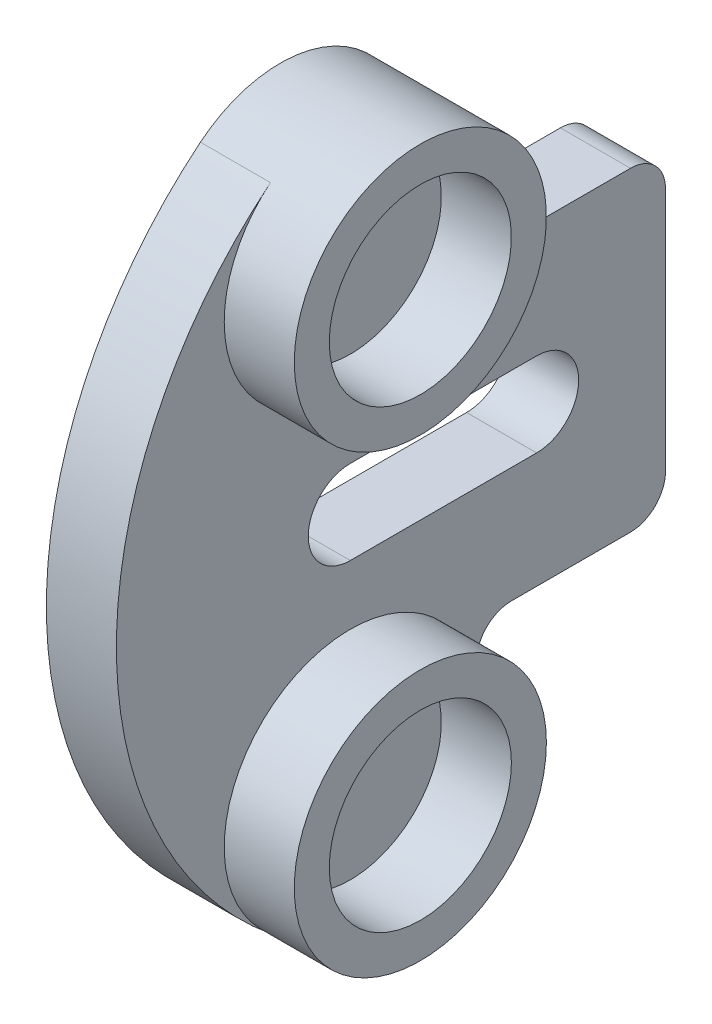
ISO-10303-21;
HEADER;
FILE_DESCRIPTION(('STEP AP214'),'2;1');
FILE_NAME('part.step','',(''),(''),'','','');
FILE_SCHEMA(('AUTOMOTIVE_DESIGN { 1 0 10303 214 1 1 1 1 }'));
ENDSEC;
DATA;
#1=APPLICATION_CONTEXT('core data for automotive mechanical design processes');
#2=APPLICATION_PROTOCOL_DEFINITION('international standard','automotive_design',2000,#1);
#3=PRODUCT_CONTEXT('',#1,'mechanical');
#4=PRODUCT('Part','Part','',(#3));
#5=PRODUCT_RELATED_PRODUCT_CATEGORY('part','',(#4));
#6=PRODUCT_DEFINITION_FORMATION('','',#4);
#7=PRODUCT_DEFINITION_CONTEXT('part definition',#1,'design');
#8=PRODUCT_DEFINITION('design','',#6,#7);
#9=PRODUCT_DEFINITION_SHAPE('','',#8);
#10=(LENGTH_UNIT() NAMED_UNIT(*) SI_UNIT(.MILLI.,.METRE.));
#11=(NAMED_UNIT(*) PLANE_ANGLE_UNIT() SI_UNIT($,.RADIAN.));
#12=(NAMED_UNIT(*) SI_UNIT($,.STERADIAN.) SOLID_ANGLE_UNIT());
#13=UNCERTAINTY_MEASURE_WITH_UNIT(LENGTH_MEASURE(1.E-05),#10,'distance_accuracy_value','');
#14=(GEOMETRIC_REPRESENTATION_CONTEXT(3) GLOBAL_UNCERTAINTY_ASSIGNED_CONTEXT((#13)) GLOBAL_UNIT_ASSIGNED_CONTEXT((#10,
#11,#12)) REPRESENTATION_CONTEXT('',''));
#15=CARTESIAN_POINT('',(0.,0.,0.));
#16=DIRECTION('',(0.,0.,1.));
#17=DIRECTION('',(1.,0.,0.));
#18=AXIS2_PLACEMENT_3D('',#15,#16,#17);
#19=CARTESIAN_POINT('',(10.,-32.5,26.6035711888461));
#20=DIRECTION('',(-1.,0.,0.));
#21=DIRECTION('',(0.,0.,1.));
#22=AXIS2_PLACEMENT_3D('',#19,#20,#21);
#23=PLANE('',#22);
#24=CARTESIAN_POINT('',(10.,-32.5,26.6035711888461));
#25=DIRECTION('',(-1.,0.,0.));
#26=DIRECTION('',(0.,0.,1.));
#27=AXIS2_PLACEMENT_3D('',#24,#25,#26);
#28=CIRCLE('',#27,18.);
#29=CARTESIAN_POINT('',(10.,-32.5,8.60357118884607));
#30=VERTEX_POINT('',#29);
#31=CARTESIAN_POINT('',(10.,-46.4285714285714,38.0051016983515));
#32=VERTEX_POINT('',#31);
#33=EDGE_CURVE('E181',#30,#32,#28,.F.);
#34=ORIENTED_EDGE('',*,*,#33,.F.);
#35=DIRECTION('',(0.,1.,0.));
#36=VECTOR('',#35,1.);
#37=CARTESIAN_POINT('',(10.,-27.5,8.60357118884607));
#38=LINE('',#37,#36);
#39=CARTESIAN_POINT('',(10.,-27.5,8.60357118884608));
#40=VERTEX_POINT('',#39);
#41=EDGE_CURVE('E225',#30,#40,#38,.T.);
#42=ORIENTED_EDGE('',*,*,#41,.T.);
#43=CARTESIAN_POINT('',(10.,-27.5,3.60357118884607));
#44=DIRECTION('',(-1.,0.,0.));
#45=DIRECTION('',(0.,0.,-1.));
#46=AXIS2_PLACEMENT_3D('',#43,#44,#45);
#47=CIRCLE('',#46,5.);
#48=CARTESIAN_POINT('',(10.,-22.5,3.60357118884607));
#49=VERTEX_POINT('',#48);
#50=EDGE_CURVE('E227',#40,#49,#47,.T.);
#51=ORIENTED_EDGE('',*,*,#50,.T.);
#52=DIRECTION('',(0.,0.,-1.));
#53=VECTOR('',#52,1.);
#54=CARTESIAN_POINT('',(10.,-22.5,-13.3964288111539));
#55=LINE('',#54,#53);
#56=CARTESIAN_POINT('',(10.,-22.5,-13.3964288111539));
#57=VERTEX_POINT('',#56);
#58=EDGE_CURVE('E230',#49,#57,#55,.T.);
#59=ORIENTED_EDGE('',*,*,#58,.T.);
#60=CARTESIAN_POINT('',(10.,-17.5,-13.3964288111539));
#61=DIRECTION('',(1.,0.,0.));
#62=DIRECTION('',(0.,0.,1.));
#63=AXIS2_PLACEMENT_3D('',#60,#61,#62);
#64=CIRCLE('',#63,5.);
#65=CARTESIAN_POINT('',(10.,-17.5,-18.3964288111539));
#66=VERTEX_POINT('',#65);
#67=EDGE_CURVE('E232',#57,#66,#64,.T.);
#68=ORIENTED_EDGE('',*,*,#67,.T.);
#69=DIRECTION('',(0.,1.,0.));
#70=VECTOR('',#69,1.);
#71=CARTESIAN_POINT('',(10.,17.5,-18.3964288111539));
#72=LINE('',#71,#70);
#73=CARTESIAN_POINT('',(10.,17.5,-18.3964288111539));
#74=VERTEX_POINT('',#73);
#75=EDGE_CURVE('E234',#66,#74,#72,.T.);
#76=ORIENTED_EDGE('',*,*,#75,.T.);
#77=CARTESIAN_POINT('',(10.,17.5,-13.3964288111539));
#78=DIRECTION('',(1.,0.,0.));
#79=DIRECTION('',(0.,0.,1.));
#80=AXIS2_PLACEMENT_3D('',#77,#78,#79);
#81=CIRCLE('',#80,5.);
#82=CARTESIAN_POINT('',(10.,22.5,-13.3964288111539));
#83=VERTEX_POINT('',#82);
#84=EDGE_CURVE('E236',#74,#83,#81,.T.);
#85=ORIENTED_EDGE('',*,*,#84,.T.);
#86=DIRECTION('',(0.,0.,1.));
#87=VECTOR('',#86,1.);
#88=CARTESIAN_POINT('',(10.,22.5,3.60357118884607));
#89=LINE('',#88,#87);
#90=CARTESIAN_POINT('',(10.,22.5,3.60357118884607));
#91=VERTEX_POINT('',#90);
#92=EDGE_CURVE('E238',#83,#91,#89,.T.);
#93=ORIENTED_EDGE('',*,*,#92,.T.);
#94=CARTESIAN_POINT('',(10.,27.5,3.60357118884607));
#95=DIRECTION('',(-1.,0.,0.));
#96=DIRECTION('',(0.,0.,-1.));
#97=AXIS2_PLACEMENT_3D('',#94,#95,#96);
#98=CIRCLE('',#97,5.);
#99=CARTESIAN_POINT('',(10.,27.5,8.60357118884607));
#100=VERTEX_POINT('',#99);
#101=EDGE_CURVE('E173',#91,#100,#98,.T.);
#102=ORIENTED_EDGE('',*,*,#101,.T.);
#103=DIRECTION('',(0.,1.,0.));
#104=VECTOR('',#103,1.);
#105=CARTESIAN_POINT('',(10.,32.5,8.60357118884607));
#106=LINE('',#105,#104);
#107=CARTESIAN_POINT('',(10.,32.5,8.60357118884607));
#108=VERTEX_POINT('',#107);
#109=EDGE_CURVE('E158',#100,#108,#106,.T.);
#110=ORIENTED_EDGE('',*,*,#109,.T.);
#111=CARTESIAN_POINT('',(10.,32.5,26.6035711888461));
#112=DIRECTION('',(-1.,0.,0.));
#113=DIRECTION('',(0.,0.,1.));
#114=AXIS2_PLACEMENT_3D('',#111,#112,#113);
#115=CIRCLE('',#114,18.);
#116=CARTESIAN_POINT('',(10.,46.4285714285714,38.0051016983516));
#117=VERTEX_POINT('',#116);
#118=EDGE_CURVE('E170',#117,#108,#115,.F.);
#119=ORIENTED_EDGE('',*,*,#118,.F.);
#120=CARTESIAN_POINT('',(10.,0.,0.));
#121=DIRECTION('',(1.,0.,0.));
#122=DIRECTION('',(0.,0.,1.));
#123=AXIS2_PLACEMENT_3D('',#120,#121,#122);
#124=CIRCLE('',#123,60.);
#125=EDGE_CURVE('E175',#117,#32,#124,.T.);
#126=ORIENTED_EDGE('',*,*,#125,.T.);
#127=EDGE_LOOP('',(#34,#42,#51,#59,#68,#76,#85,#93,#102,#110,#119,#126));
#128=FACE_BOUND('',#127,.T.);
#129=CARTESIAN_POINT('',(10.,0.,26.6035711888461));
#130=DIRECTION('',(1.,0.,0.));
#131=DIRECTION('',(0.,0.,-1.));
#132=AXIS2_PLACEMENT_3D('',#129,#130,#131);
#133=CIRCLE('',#132,6.);
#134=CARTESIAN_POINT('',(10.,6.,26.6035711888461));
#135=VERTEX_POINT('',#134);
#136=CARTESIAN_POINT('',(10.,-6.,26.6035711888461));
#137=VERTEX_POINT('',#136);
#138=EDGE_CURVE('E199',#135,#137,#133,.T.);
#139=ORIENTED_EDGE('',*,*,#138,.F.);
#140=DIRECTION('',(0.,0.,1.));
#141=VECTOR('',#140,1.);
#142=CARTESIAN_POINT('',(10.,6.,26.6035711888461));
#143=LINE('',#142,#141);
#144=CARTESIAN_POINT('',(10.,6.,0.));
#145=VERTEX_POINT('',#144);
#146=EDGE_CURVE('E206',#145,#135,#143,.T.);
#147=ORIENTED_EDGE('',*,*,#146,.F.);
#148=CARTESIAN_POINT('',(10.,0.,0.));
#149=DIRECTION('',(1.,0.,0.));
#150=DIRECTION('',(0.,0.,-1.));
#151=AXIS2_PLACEMENT_3D('',#148,#149,#150);
#152=CIRCLE('',#151,6.);
#153=CARTESIAN_POINT('',(10.,-6.,0.));
#154=VERTEX_POINT('',#153);
#155=EDGE_CURVE('E204',#154,#145,#152,.T.);
#156=ORIENTED_EDGE('',*,*,#155,.F.);
#157=DIRECTION('',(0.,0.,-1.));
#158=VECTOR('',#157,1.);
#159=CARTESIAN_POINT('',(10.,-6.,26.6035711888461));
#160=LINE('',#159,#158);
#161=EDGE_CURVE('E201',#137,#154,#160,.T.);
#162=ORIENTED_EDGE('',*,*,#161,.F.);
#163=EDGE_LOOP('',(#139,#147,#156,#162));
#164=FACE_BOUND('',#163,.T.);
#165=ADVANCED_FACE('F39',(#128,#164),#23,.F.);
#166=CARTESIAN_POINT('',(0.,-32.5,26.6035711888461));
#167=DIRECTION('',(-1.,0.,0.));
#168=DIRECTION('',(0.,0.,1.));
#169=AXIS2_PLACEMENT_3D('',#166,#167,#168);
#170=PLANE('',#169);
#171=DIRECTION('',(0.,1.,0.));
#172=VECTOR('',#171,1.);
#173=CARTESIAN_POINT('',(0.,-27.5,8.60357118884607));
#174=LINE('',#173,#172);
#175=CARTESIAN_POINT('',(0.,-32.5,8.60357118884607));
#176=VERTEX_POINT('',#175);
#177=CARTESIAN_POINT('',(0.,-27.5,8.60357118884608));
#178=VERTEX_POINT('',#177);
#179=EDGE_CURVE('E245',#176,#178,#174,.T.);
#180=ORIENTED_EDGE('',*,*,#179,.F.);
#181=CARTESIAN_POINT('',(0.,-32.5,26.6035711888461));
#182=DIRECTION('',(1.,0.,0.));
#183=DIRECTION('',(0.,0.,1.));
#184=AXIS2_PLACEMENT_3D('',#181,#182,#183);
#185=CIRCLE('',#184,18.);
#186=CARTESIAN_POINT('',(0.,-46.4285714285714,38.0051016983515));
#187=VERTEX_POINT('',#186);
#188=EDGE_CURVE('E224',#187,#176,#185,.T.);
#189=ORIENTED_EDGE('',*,*,#188,.F.);
#190=CARTESIAN_POINT('',(0.,0.,0.));
#191=DIRECTION('',(1.,0.,0.));
#192=DIRECTION('',(0.,0.,1.));
#193=AXIS2_PLACEMENT_3D('',#190,#191,#192);
#194=CIRCLE('',#193,60.);
#195=CARTESIAN_POINT('',(0.,46.4285714285714,38.0051016983516));
#196=VERTEX_POINT('',#195);
#197=EDGE_CURVE('E228',#196,#187,#194,.T.);
#198=ORIENTED_EDGE('',*,*,#197,.F.);
#199=CARTESIAN_POINT('',(0.,32.5,26.6035711888461));
#200=DIRECTION('',(1.,0.,0.));
#201=DIRECTION('',(0.,0.,-1.));
#202=AXIS2_PLACEMENT_3D('',#199,#200,#201);
#203=CIRCLE('',#202,18.);
#204=CARTESIAN_POINT('',(0.,32.5,8.60357118884607));
#205=VERTEX_POINT('',#204);
#206=EDGE_CURVE('E262',#205,#196,#203,.T.);
#207=ORIENTED_EDGE('',*,*,#206,.F.);
#208=DIRECTION('',(0.,1.,0.));
#209=VECTOR('',#208,1.);
#210=CARTESIAN_POINT('',(0.,32.5,8.60357118884607));
#211=LINE('',#210,#209);
#212=CARTESIAN_POINT('',(0.,27.5,8.60357118884607));
#213=VERTEX_POINT('',#212);
#214=EDGE_CURVE('E160',#213,#205,#211,.T.);
#215=ORIENTED_EDGE('',*,*,#214,.F.);
#216=CARTESIAN_POINT('',(0.,27.5,3.60357118884607));
#217=DIRECTION('',(-1.,0.,0.));
#218=DIRECTION('',(0.,0.,-1.));
#219=AXIS2_PLACEMENT_3D('',#216,#217,#218);
#220=CIRCLE('',#219,5.);
#221=CARTESIAN_POINT('',(0.,22.5,3.60357118884607));
#222=VERTEX_POINT('',#221);
#223=EDGE_CURVE('E259',#222,#213,#220,.T.);
#224=ORIENTED_EDGE('',*,*,#223,.F.);
#225=DIRECTION('',(0.,0.,1.));
#226=VECTOR('',#225,1.);
#227=CARTESIAN_POINT('',(0.,22.5,3.60357118884607));
#228=LINE('',#227,#226);
#229=CARTESIAN_POINT('',(0.,22.5,-13.3964288111539));
#230=VERTEX_POINT('',#229);
#231=EDGE_CURVE('E257',#230,#222,#228,.T.);
#232=ORIENTED_EDGE('',*,*,#231,.F.);
#233=CARTESIAN_POINT('',(0.,17.5,-13.3964288111539));
#234=DIRECTION('',(1.,0.,0.));
#235=DIRECTION('',(0.,0.,1.));
#236=AXIS2_PLACEMENT_3D('',#233,#234,#235);
#237=CIRCLE('',#236,5.);
#238=CARTESIAN_POINT('',(0.,17.5,-18.3964288111539));
#239=VERTEX_POINT('',#238);
#240=EDGE_CURVE('E255',#239,#230,#237,.T.);
#241=ORIENTED_EDGE('',*,*,#240,.F.);
#242=DIRECTION('',(0.,1.,0.));
#243=VECTOR('',#242,1.);
#244=CARTESIAN_POINT('',(0.,17.5,-18.3964288111539));
#245=LINE('',#244,#243);
#246=CARTESIAN_POINT('',(0.,-17.5,-18.3964288111539));
#247=VERTEX_POINT('',#246);
#248=EDGE_CURVE('E253',#247,#239,#245,.T.);
#249=ORIENTED_EDGE('',*,*,#248,.F.);
#250=CARTESIAN_POINT('',(0.,-17.5,-13.3964288111539));
#251=DIRECTION('',(1.,0.,0.));
#252=DIRECTION('',(0.,0.,1.));
#253=AXIS2_PLACEMENT_3D('',#250,#251,#252);
#254=CIRCLE('',#253,5.);
#255=CARTESIAN_POINT('',(0.,-22.5,-13.3964288111539));
#256=VERTEX_POINT('',#255);
#257=EDGE_CURVE('E251',#256,#247,#254,.T.);
#258=ORIENTED_EDGE('',*,*,#257,.F.);
#259=DIRECTION('',(0.,0.,-1.));
#260=VECTOR('',#259,1.);
#261=CARTESIAN_POINT('',(0.,-22.5,-13.3964288111539));
#262=LINE('',#261,#260);
#263=CARTESIAN_POINT('',(0.,-22.5,3.60357118884607));
#264=VERTEX_POINT('',#263);
#265=EDGE_CURVE('E249',#264,#256,#262,.T.);
#266=ORIENTED_EDGE('',*,*,#265,.F.);
#267=CARTESIAN_POINT('',(0.,-27.5,3.60357118884607));
#268=DIRECTION('',(-1.,0.,0.));
#269=DIRECTION('',(0.,0.,-1.));
#270=AXIS2_PLACEMENT_3D('',#267,#268,#269);
#271=CIRCLE('',#270,5.);
#272=EDGE_CURVE('E247',#178,#264,#271,.T.);
#273=ORIENTED_EDGE('',*,*,#272,.F.);
#274=EDGE_LOOP('',(#180,#189,#198,#207,#215,#224,#232,#241,#249,#258,#266,#273));
#275=FACE_BOUND('',#274,.T.);
#276=DIRECTION('',(0.,0.,1.));
#277=VECTOR('',#276,1.);
#278=CARTESIAN_POINT('',(0.,6.,26.6035711888461));
#279=LINE('',#278,#277);
#280=CARTESIAN_POINT('',(0.,6.,0.));
#281=VERTEX_POINT('',#280);
#282=CARTESIAN_POINT('',(0.,6.,26.6035711888461));
#283=VERTEX_POINT('',#282);
#284=EDGE_CURVE('E202',#281,#283,#279,.T.);
#285=ORIENTED_EDGE('',*,*,#284,.T.);
#286=CARTESIAN_POINT('',(0.,0.,26.6035711888461));
#287=DIRECTION('',(1.,0.,0.));
#288=DIRECTION('',(0.,0.,-1.));
#289=AXIS2_PLACEMENT_3D('',#286,#287,#288);
#290=CIRCLE('',#289,6.);
#291=CARTESIAN_POINT('',(0.,-6.,26.6035711888461));
#292=VERTEX_POINT('',#291);
#293=EDGE_CURVE('E62',#283,#292,#290,.T.);
#294=ORIENTED_EDGE('',*,*,#293,.T.);
#295=DIRECTION('',(0.,0.,-1.));
#296=VECTOR('',#295,1.);
#297=CARTESIAN_POINT('',(0.,-6.,26.6035711888461));
#298=LINE('',#297,#296);
#299=CARTESIAN_POINT('',(0.,-6.,0.));
#300=VERTEX_POINT('',#299);
#301=EDGE_CURVE('E210',#292,#300,#298,.T.);
#302=ORIENTED_EDGE('',*,*,#301,.T.);
#303=CARTESIAN_POINT('',(0.,0.,0.));
#304=DIRECTION('',(1.,0.,0.));
#305=DIRECTION('',(0.,0.,-1.));
#306=AXIS2_PLACEMENT_3D('',#303,#304,#305);
#307=CIRCLE('',#306,6.);
#308=EDGE_CURVE('E213',#300,#281,#307,.T.);
#309=ORIENTED_EDGE('',*,*,#308,.T.);
#310=EDGE_LOOP('',(#285,#294,#302,#309));
#311=FACE_BOUND('',#310,.T.);
#312=ADVANCED_FACE('F297',(#275,#311),#170,.T.);
#313=CARTESIAN_POINT('',(10.,-32.5,26.6035711888461));
#314=DIRECTION('',(-1.,0.,0.));
#315=DIRECTION('',(0.,0.,1.));
#316=AXIS2_PLACEMENT_3D('',#313,#314,#315);
#317=CYLINDRICAL_SURFACE('',#316,18.);
#318=ORIENTED_EDGE('',*,*,#188,.T.);
#319=DIRECTION('',(-1.,0.,0.));
#320=VECTOR('',#319,1.);
#321=CARTESIAN_POINT('',(10.,-32.5,8.60357118884607));
#322=LINE('',#321,#320);
#323=EDGE_CURVE('E11',#30,#176,#322,.T.);
#324=ORIENTED_EDGE('',*,*,#323,.F.);
#325=ORIENTED_EDGE('',*,*,#33,.T.);
#326=DIRECTION('',(-1.,0.,0.));
#327=VECTOR('',#326,1.);
#328=CARTESIAN_POINT('',(10.,-46.4285714285714,38.0051016983515));
#329=LINE('',#328,#327);
#330=EDGE_CURVE('E242',#32,#187,#329,.T.);
#331=ORIENTED_EDGE('',*,*,#330,.T.);
#332=EDGE_LOOP('',(#318,#324,#325,#331));
#333=FACE_BOUND('',#332,.T.);
#334=CARTESIAN_POINT('',(20.,-32.5,26.6035711888461));
#335=DIRECTION('',(1.,0.,0.));
#336=DIRECTION('',(0.,0.,-1.));
#337=AXIS2_PLACEMENT_3D('',#334,#335,#336);
#338=CIRCLE('',#337,18.);
#339=CARTESIAN_POINT('',(20.,-32.5,8.60357118884607));
#340=VERTEX_POINT('',#339);
#341=EDGE_CURVE('E182',#340,#340,#338,.T.);
#342=ORIENTED_EDGE('',*,*,#341,.F.);
#343=EDGE_LOOP('',(#342));
#344=FACE_BOUND('',#343,.T.);
#345=ADVANCED_FACE('F41',(#333,#344),#317,.T.);
#346=CARTESIAN_POINT('',(10.,-27.5,8.60357118884607));
#347=DIRECTION('',(0.,0.,1.));
#348=DIRECTION('',(0.,-1.,0.));
#349=AXIS2_PLACEMENT_3D('',#346,#347,#348);
#350=PLANE('',#349);
#351=ORIENTED_EDGE('',*,*,#179,.T.);
#352=DIRECTION('',(-1.,0.,0.));
#353=VECTOR('',#352,1.);
#354=CARTESIAN_POINT('',(10.,-27.5,8.60357118884608));
#355=LINE('',#354,#353);
#356=EDGE_CURVE('E47',#40,#178,#355,.T.);
#357=ORIENTED_EDGE('',*,*,#356,.F.);
#358=ORIENTED_EDGE('',*,*,#41,.F.);
#359=ORIENTED_EDGE('',*,*,#323,.T.);
#360=EDGE_LOOP('',(#351,#357,#358,#359));
#361=FACE_BOUND('',#360,.T.);
#362=ADVANCED_FACE('F313',(#361),#350,.F.);
#363=CARTESIAN_POINT('',(10.,-27.5,3.60357118884607));
#364=DIRECTION('',(-1.,0.,0.));
#365=DIRECTION('',(0.,0.,1.));
#366=AXIS2_PLACEMENT_3D('',#363,#364,#365);
#367=CYLINDRICAL_SURFACE('',#366,5.);
#368=ORIENTED_EDGE('',*,*,#272,.T.);
#369=DIRECTION('',(-1.,0.,0.));
#370=VECTOR('',#369,1.);
#371=CARTESIAN_POINT('',(10.,-22.5,3.60357118884607));
#372=LINE('',#371,#370);
#373=EDGE_CURVE('E284',#49,#264,#372,.T.);
#374=ORIENTED_EDGE('',*,*,#373,.F.);
#375=ORIENTED_EDGE('',*,*,#50,.F.);
#376=ORIENTED_EDGE('',*,*,#356,.T.);
#377=EDGE_LOOP('',(#368,#374,#375,#376));
#378=FACE_BOUND('',#377,.T.);
#379=ADVANCED_FACE('F291',(#378),#367,.F.);
#380=CARTESIAN_POINT('',(10.,-22.5,-13.3964288111539));
#381=DIRECTION('',(0.,1.,0.));
#382=DIRECTION('',(0.,0.,1.));
#383=AXIS2_PLACEMENT_3D('',#380,#381,#382);
#384=PLANE('',#383);
#385=ORIENTED_EDGE('',*,*,#265,.T.);
#386=DIRECTION('',(-1.,0.,0.));
#387=VECTOR('',#386,1.);
#388=CARTESIAN_POINT('',(10.,-22.5,-13.3964288111539));
#389=LINE('',#388,#387);
#390=EDGE_CURVE('E281',#57,#256,#389,.T.);
#391=ORIENTED_EDGE('',*,*,#390,.F.);
#392=ORIENTED_EDGE('',*,*,#58,.F.);
#393=ORIENTED_EDGE('',*,*,#373,.T.);
#394=EDGE_LOOP('',(#385,#391,#392,#393));
#395=FACE_BOUND('',#394,.T.);
#396=ADVANCED_FACE('F304',(#395),#384,.F.);
#397=CARTESIAN_POINT('',(10.,-17.5,-13.3964288111539));
#398=DIRECTION('',(-1.,0.,0.));
#399=DIRECTION('',(0.,0.,1.));
#400=AXIS2_PLACEMENT_3D('',#397,#398,#399);
#401=CYLINDRICAL_SURFACE('',#400,5.);
#402=ORIENTED_EDGE('',*,*,#257,.T.);
#403=DIRECTION('',(-1.,0.,0.));
#404=VECTOR('',#403,1.);
#405=CARTESIAN_POINT('',(10.,-17.5,-18.3964288111539));
#406=LINE('',#405,#404);
#407=EDGE_CURVE('E278',#66,#247,#406,.T.);
#408=ORIENTED_EDGE('',*,*,#407,.F.);
#409=ORIENTED_EDGE('',*,*,#67,.F.);
#410=ORIENTED_EDGE('',*,*,#390,.T.);
#411=EDGE_LOOP('',(#402,#408,#409,#410));
#412=FACE_BOUND('',#411,.T.);
#413=ADVANCED_FACE('F308',(#412),#401,.T.);
#414=CARTESIAN_POINT('',(10.,17.5,-18.3964288111539));
#415=DIRECTION('',(0.,0.,1.));
#416=DIRECTION('',(1.,0.,0.));
#417=AXIS2_PLACEMENT_3D('',#414,#415,#416);
#418=PLANE('',#417);
#419=ORIENTED_EDGE('',*,*,#248,.T.);
#420=DIRECTION('',(-1.,0.,0.));
#421=VECTOR('',#420,1.);
#422=CARTESIAN_POINT('',(10.,17.5,-18.3964288111539));
#423=LINE('',#422,#421);
#424=EDGE_CURVE('E275',#74,#239,#423,.T.);
#425=ORIENTED_EDGE('',*,*,#424,.F.);
#426=ORIENTED_EDGE('',*,*,#75,.F.);
#427=ORIENTED_EDGE('',*,*,#407,.T.);
#428=EDGE_LOOP('',(#419,#425,#426,#427));
#429=FACE_BOUND('',#428,.T.);
#430=ADVANCED_FACE('F490',(#429),#418,.F.);
#431=CARTESIAN_POINT('',(10.,17.5,-13.3964288111539));
#432=DIRECTION('',(-1.,0.,0.));
#433=DIRECTION('',(0.,0.,1.));
#434=AXIS2_PLACEMENT_3D('',#431,#432,#433);
#435=CYLINDRICAL_SURFACE('',#434,5.);
#436=ORIENTED_EDGE('',*,*,#240,.T.);
#437=DIRECTION('',(-1.,0.,0.));
#438=VECTOR('',#437,1.);
#439=CARTESIAN_POINT('',(10.,22.5,-13.3964288111539));
#440=LINE('',#439,#438);
#441=EDGE_CURVE('E272',#83,#230,#440,.T.);
#442=ORIENTED_EDGE('',*,*,#441,.F.);
#443=ORIENTED_EDGE('',*,*,#84,.F.);
#444=ORIENTED_EDGE('',*,*,#424,.T.);
#445=EDGE_LOOP('',(#436,#442,#443,#444));
#446=FACE_BOUND('',#445,.T.);
#447=ADVANCED_FACE('F499',(#446),#435,.T.);
#448=CARTESIAN_POINT('',(10.,22.5,3.60357118884607));
#449=DIRECTION('',(0.,-1.,0.));
#450=DIRECTION('',(0.,0.,-1.));
#451=AXIS2_PLACEMENT_3D('',#448,#449,#450);
#452=PLANE('',#451);
#453=ORIENTED_EDGE('',*,*,#231,.T.);
#454=DIRECTION('',(-1.,0.,0.));
#455=VECTOR('',#454,1.);
#456=CARTESIAN_POINT('',(10.,22.5,3.60357118884607));
#457=LINE('',#456,#455);
#458=EDGE_CURVE('E269',#91,#222,#457,.T.);
#459=ORIENTED_EDGE('',*,*,#458,.F.);
#460=ORIENTED_EDGE('',*,*,#92,.F.);
#461=ORIENTED_EDGE('',*,*,#441,.T.);
#462=EDGE_LOOP('',(#453,#459,#460,#461));
#463=FACE_BOUND('',#462,.T.);
#464=ADVANCED_FACE('F509',(#463),#452,.F.);
#465=CARTESIAN_POINT('',(10.,27.5,3.60357118884607));
#466=DIRECTION('',(-1.,0.,0.));
#467=DIRECTION('',(0.,0.,1.));
#468=AXIS2_PLACEMENT_3D('',#465,#466,#467);
#469=CYLINDRICAL_SURFACE('',#468,5.);
#470=ORIENTED_EDGE('',*,*,#223,.T.);
#471=DIRECTION('',(-1.,0.,0.));
#472=VECTOR('',#471,1.);
#473=CARTESIAN_POINT('',(10.,27.5,8.60357118884607));
#474=LINE('',#473,#472);
#475=EDGE_CURVE('E164',#100,#213,#474,.T.);
#476=ORIENTED_EDGE('',*,*,#475,.F.);
#477=ORIENTED_EDGE('',*,*,#101,.F.);
#478=ORIENTED_EDGE('',*,*,#458,.T.);
#479=EDGE_LOOP('',(#470,#476,#477,#478));
#480=FACE_BOUND('',#479,.T.);
#481=ADVANCED_FACE('F519',(#480),#469,.F.);
#482=CARTESIAN_POINT('',(10.,32.5,8.60357118884607));
#483=DIRECTION('',(0.,0.,1.));
#484=DIRECTION('',(0.,-1.,0.));
#485=AXIS2_PLACEMENT_3D('',#482,#483,#484);
#486=PLANE('',#485);
#487=ORIENTED_EDGE('',*,*,#214,.T.);
#488=DIRECTION('',(-1.,0.,0.));
#489=VECTOR('',#488,1.);
#490=CARTESIAN_POINT('',(10.,32.5,8.60357118884607));
#491=LINE('',#490,#489);
#492=EDGE_CURVE('E154',#108,#205,#491,.T.);
#493=ORIENTED_EDGE('',*,*,#492,.F.);
#494=ORIENTED_EDGE('',*,*,#109,.F.);
#495=ORIENTED_EDGE('',*,*,#475,.T.);
#496=EDGE_LOOP('',(#487,#493,#494,#495));
#497=FACE_BOUND('',#496,.T.);
#498=ADVANCED_FACE('F156',(#497),#486,.F.);
#499=CARTESIAN_POINT('',(10.,32.5,26.6035711888461));
#500=DIRECTION('',(-1.,0.,0.));
#501=DIRECTION('',(0.,0.,1.));
#502=AXIS2_PLACEMENT_3D('',#499,#500,#501);
#503=CYLINDRICAL_SURFACE('',#502,18.);
#504=ORIENTED_EDGE('',*,*,#206,.T.);
#505=DIRECTION('',(-1.,0.,0.));
#506=VECTOR('',#505,1.);
#507=CARTESIAN_POINT('',(10.,46.4285714285714,38.0051016983516));
#508=LINE('',#507,#506);
#509=EDGE_CURVE('E165',#117,#196,#508,.T.);
#510=ORIENTED_EDGE('',*,*,#509,.F.);
#511=ORIENTED_EDGE('',*,*,#118,.T.);
#512=ORIENTED_EDGE('',*,*,#492,.T.);
#513=EDGE_LOOP('',(#504,#510,#511,#512));
#514=FACE_BOUND('',#513,.T.);
#515=CARTESIAN_POINT('',(20.,32.5,26.6035711888461));
#516=DIRECTION('',(1.,0.,0.));
#517=DIRECTION('',(0.,0.,1.));
#518=AXIS2_PLACEMENT_3D('',#515,#516,#517);
#519=CIRCLE('',#518,18.);
#520=CARTESIAN_POINT('',(20.,32.5,44.6035711888461));
#521=VERTEX_POINT('',#520);
#522=EDGE_CURVE('E458',#521,#521,#519,.T.);
#523=ORIENTED_EDGE('',*,*,#522,.F.);
#524=EDGE_LOOP('',(#523));
#525=FACE_BOUND('',#524,.T.);
#526=ADVANCED_FACE('F177',(#514,#525),#503,.T.);
#527=CARTESIAN_POINT('',(10.,0.,0.));
#528=DIRECTION('',(-1.,0.,0.));
#529=DIRECTION('',(0.,0.,1.));
#530=AXIS2_PLACEMENT_3D('',#527,#528,#529);
#531=CYLINDRICAL_SURFACE('',#530,60.);
#532=ORIENTED_EDGE('',*,*,#197,.T.);
#533=ORIENTED_EDGE('',*,*,#330,.F.);
#534=ORIENTED_EDGE('',*,*,#125,.F.);
#535=ORIENTED_EDGE('',*,*,#509,.T.);
#536=EDGE_LOOP('',(#532,#533,#534,#535));
#537=FACE_BOUND('',#536,.T.);
#538=ADVANCED_FACE('F318',(#537),#531,.T.);
#539=CARTESIAN_POINT('',(10.,0.,26.6035711888461));
#540=DIRECTION('',(-1.,0.,0.));
#541=DIRECTION('',(0.,0.,1.));
#542=AXIS2_PLACEMENT_3D('',#539,#540,#541);
#543=CYLINDRICAL_SURFACE('',#542,6.);
#544=ORIENTED_EDGE('',*,*,#293,.F.);
#545=DIRECTION('',(-1.,0.,0.));
#546=VECTOR('',#545,1.);
#547=CARTESIAN_POINT('',(10.,6.,26.6035711888461));
#548=LINE('',#547,#546);
#549=EDGE_CURVE('E208',#135,#283,#548,.T.);
#550=ORIENTED_EDGE('',*,*,#549,.F.);
#551=ORIENTED_EDGE('',*,*,#138,.T.);
#552=DIRECTION('',(-1.,0.,0.));
#553=VECTOR('',#552,1.);
#554=CARTESIAN_POINT('',(10.,-6.,26.6035711888461));
#555=LINE('',#554,#553);
#556=EDGE_CURVE('E222',#137,#292,#555,.T.);
#557=ORIENTED_EDGE('',*,*,#556,.T.);
#558=EDGE_LOOP('',(#544,#550,#551,#557));
#559=FACE_BOUND('',#558,.T.);
#560=ADVANCED_FACE('F320',(#559),#543,.F.);
#561=CARTESIAN_POINT('',(10.,-6.,26.6035711888461));
#562=DIRECTION('',(0.,1.,0.));
#563=DIRECTION('',(0.,0.,1.));
#564=AXIS2_PLACEMENT_3D('',#561,#562,#563);
#565=PLANE('',#564);
#566=ORIENTED_EDGE('',*,*,#301,.F.);
#567=ORIENTED_EDGE('',*,*,#556,.F.);
#568=ORIENTED_EDGE('',*,*,#161,.T.);
#569=DIRECTION('',(-1.,0.,0.));
#570=VECTOR('',#569,1.);
#571=CARTESIAN_POINT('',(10.,-6.,0.));
#572=LINE('',#571,#570);
#573=EDGE_CURVE('E220',#154,#300,#572,.T.);
#574=ORIENTED_EDGE('',*,*,#573,.T.);
#575=EDGE_LOOP('',(#566,#567,#568,#574));
#576=FACE_BOUND('',#575,.T.);
#577=ADVANCED_FACE('F327',(#576),#565,.T.);
#578=CARTESIAN_POINT('',(10.,0.,0.));
#579=DIRECTION('',(-1.,0.,0.));
#580=DIRECTION('',(0.,0.,1.));
#581=AXIS2_PLACEMENT_3D('',#578,#579,#580);
#582=CYLINDRICAL_SURFACE('',#581,6.);
#583=ORIENTED_EDGE('',*,*,#308,.F.);
#584=ORIENTED_EDGE('',*,*,#573,.F.);
#585=ORIENTED_EDGE('',*,*,#155,.T.);
#586=DIRECTION('',(-1.,0.,0.));
#587=VECTOR('',#586,1.);
#588=CARTESIAN_POINT('',(10.,6.,0.));
#589=LINE('',#588,#587);
#590=EDGE_CURVE('E54',#145,#281,#589,.T.);
#591=ORIENTED_EDGE('',*,*,#590,.T.);
#592=EDGE_LOOP('',(#583,#584,#585,#591));
#593=FACE_BOUND('',#592,.T.);
#594=ADVANCED_FACE('F362',(#593),#582,.F.);
#595=CARTESIAN_POINT('',(10.,6.,26.6035711888461));
#596=DIRECTION('',(0.,-1.,0.));
#597=DIRECTION('',(0.,0.,-1.));
#598=AXIS2_PLACEMENT_3D('',#595,#596,#597);
#599=PLANE('',#598);
#600=ORIENTED_EDGE('',*,*,#284,.F.);
#601=ORIENTED_EDGE('',*,*,#590,.F.);
#602=ORIENTED_EDGE('',*,*,#146,.T.);
#603=ORIENTED_EDGE('',*,*,#549,.T.);
#604=EDGE_LOOP('',(#600,#601,#602,#603));
#605=FACE_BOUND('',#604,.T.);
#606=ADVANCED_FACE('F354',(#605),#599,.T.);
#607=CARTESIAN_POINT('',(20.,32.5,26.6035711888461));
#608=DIRECTION('',(-1.,0.,0.));
#609=DIRECTION('',(0.,0.,1.));
#610=AXIS2_PLACEMENT_3D('',#607,#608,#609);
#611=CYLINDRICAL_SURFACE('',#610,13.);
#612=CARTESIAN_POINT('',(20.,32.5,26.6035711888461));
#613=DIRECTION('',(1.,0.,0.));
#614=DIRECTION('',(0.,0.,1.));
#615=AXIS2_PLACEMENT_3D('',#612,#613,#614);
#616=CIRCLE('',#615,13.);
#617=CARTESIAN_POINT('',(20.,32.5,39.6035711888461));
#618=VERTEX_POINT('',#617);
#619=EDGE_CURVE('E191',#618,#618,#616,.T.);
#620=ORIENTED_EDGE('',*,*,#619,.T.);
#621=EDGE_LOOP('',(#620));
#622=FACE_BOUND('',#621,.T.);
#623=CARTESIAN_POINT('',(10.,32.5,26.6035711888461));
#624=DIRECTION('',(-1.,0.,0.));
#625=DIRECTION('',(0.,0.,1.));
#626=AXIS2_PLACEMENT_3D('',#623,#624,#625);
#627=CIRCLE('',#626,13.);
#628=CARTESIAN_POINT('',(10.,32.5,39.6035711888461));
#629=VERTEX_POINT('',#628);
#630=EDGE_CURVE('E185',#629,#629,#627,.F.);
#631=ORIENTED_EDGE('',*,*,#630,.F.);
#632=EDGE_LOOP('',(#631));
#633=FACE_BOUND('',#632,.T.);
#634=ADVANCED_FACE('F352',(#622,#633),#611,.F.);
#635=CARTESIAN_POINT('',(20.,32.5,26.6035711888461));
#636=DIRECTION('',(-1.,0.,0.));
#637=DIRECTION('',(0.,0.,1.));
#638=AXIS2_PLACEMENT_3D('',#635,#636,#637);
#639=PLANE('',#638);
#640=ORIENTED_EDGE('',*,*,#522,.T.);
#641=EDGE_LOOP('',(#640));
#642=FACE_BOUND('',#641,.T.);
#643=ORIENTED_EDGE('',*,*,#619,.F.);
#644=EDGE_LOOP('',(#643));
#645=FACE_BOUND('',#644,.T.);
#646=ADVANCED_FACE('F353',(#642,#645),#639,.F.);
#647=CARTESIAN_POINT('',(20.,-32.5,26.6035711888461));
#648=DIRECTION('',(-1.,0.,0.));
#649=DIRECTION('',(0.,0.,1.));
#650=AXIS2_PLACEMENT_3D('',#647,#648,#649);
#651=CYLINDRICAL_SURFACE('',#650,13.);
#652=CARTESIAN_POINT('',(20.,-32.5,26.6035711888461));
#653=DIRECTION('',(1.,0.,0.));
#654=DIRECTION('',(0.,0.,-1.));
#655=AXIS2_PLACEMENT_3D('',#652,#653,#654);
#656=CIRCLE('',#655,13.);
#657=CARTESIAN_POINT('',(20.,-32.5,13.6035711888461));
#658=VERTEX_POINT('',#657);
#659=EDGE_CURVE('E188',#658,#658,#656,.T.);
#660=ORIENTED_EDGE('',*,*,#659,.T.);
#661=EDGE_LOOP('',(#660));
#662=FACE_BOUND('',#661,.T.);
#663=CARTESIAN_POINT('',(10.,-32.5,26.6035711888461));
#664=DIRECTION('',(-1.,0.,0.));
#665=DIRECTION('',(0.,0.,1.));
#666=AXIS2_PLACEMENT_3D('',#663,#664,#665);
#667=CIRCLE('',#666,13.);
#668=CARTESIAN_POINT('',(10.,-32.5,39.6035711888461));
#669=VERTEX_POINT('',#668);
#670=EDGE_CURVE('E196',#669,#669,#667,.F.);
#671=ORIENTED_EDGE('',*,*,#670,.F.);
#672=EDGE_LOOP('',(#671));
#673=FACE_BOUND('',#672,.T.);
#674=ADVANCED_FACE('F347',(#662,#673),#651,.F.);
#675=CARTESIAN_POINT('',(20.,-32.5,26.6035711888461));
#676=DIRECTION('',(1.,0.,0.));
#677=DIRECTION('',(0.,0.,-1.));
#678=AXIS2_PLACEMENT_3D('',#675,#676,#677);
#679=PLANE('',#678);
#680=ORIENTED_EDGE('',*,*,#341,.T.);
#681=EDGE_LOOP('',(#680));
#682=FACE_BOUND('',#681,.T.);
#683=ORIENTED_EDGE('',*,*,#659,.F.);
#684=EDGE_LOOP('',(#683));
#685=FACE_BOUND('',#684,.T.);
#686=ADVANCED_FACE('F342',(#682,#685),#679,.T.);
#687=ORIENTED_EDGE('',*,*,#630,.T.);
#688=EDGE_LOOP('',(#687));
#689=FACE_BOUND('',#688,.T.);
#690=ADVANCED_FACE('F334',(#689),#23,.F.);
#691=ORIENTED_EDGE('',*,*,#670,.T.);
#692=EDGE_LOOP('',(#691));
#693=FACE_BOUND('',#692,.T.);
#694=ADVANCED_FACE('F333',(#693),#23,.F.);
#695=CLOSED_SHELL('',(#165,#312,#345,#362,#379,#396,#413,#430,#447,#464,#481,#498,#526,#538,
#560,#577,#594,#606,#634,#646,#674,#686,#690,#694));
#696=MANIFOLD_SOLID_BREP('B2',#695);
#697=ADVANCED_BREP_SHAPE_REPRESENTATION('',(#18,#696),#14);
#698=SHAPE_DEFINITION_REPRESENTATION(#9,#697);
ENDSEC;
END-ISO-10303-21;
